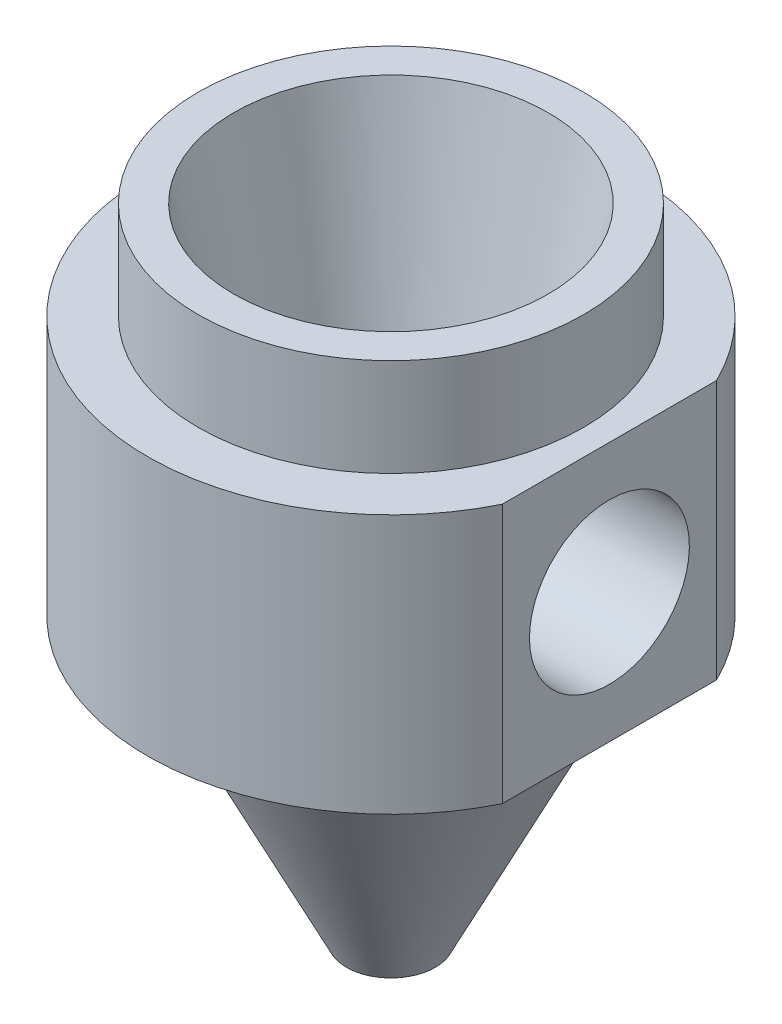
ISO-10303-21;
HEADER;
FILE_DESCRIPTION(('STEP AP214'),'2;1');
FILE_NAME('part.step','',(''),(''),'','','');
FILE_SCHEMA(('AUTOMOTIVE_DESIGN { 1 0 10303 214 1 1 1 1 }'));
ENDSEC;
DATA;
#1=APPLICATION_CONTEXT('core data for automotive mechanical design processes');
#2=APPLICATION_PROTOCOL_DEFINITION('international standard','automotive_design',2000,#1);
#3=PRODUCT_CONTEXT('',#1,'mechanical');
#4=PRODUCT('Part','Part','',(#3));
#5=PRODUCT_RELATED_PRODUCT_CATEGORY('part','',(#4));
#6=PRODUCT_DEFINITION_FORMATION('','',#4);
#7=PRODUCT_DEFINITION_CONTEXT('part definition',#1,'design');
#8=PRODUCT_DEFINITION('design','',#6,#7);
#9=PRODUCT_DEFINITION_SHAPE('','',#8);
#10=(LENGTH_UNIT() NAMED_UNIT(*) SI_UNIT(.MILLI.,.METRE.));
#11=(NAMED_UNIT(*) PLANE_ANGLE_UNIT() SI_UNIT($,.RADIAN.));
#12=(NAMED_UNIT(*) SI_UNIT($,.STERADIAN.) SOLID_ANGLE_UNIT());
#13=UNCERTAINTY_MEASURE_WITH_UNIT(LENGTH_MEASURE(1.E-05),#10,'distance_accuracy_value','');
#14=(GEOMETRIC_REPRESENTATION_CONTEXT(3) GLOBAL_UNCERTAINTY_ASSIGNED_CONTEXT((#13)) GLOBAL_UNIT_ASSIGNED_CONTEXT((#10,
#11,#12)) REPRESENTATION_CONTEXT('',''));
#15=CARTESIAN_POINT('',(0.,0.,0.));
#16=DIRECTION('',(0.,0.,1.));
#17=DIRECTION('',(1.,0.,0.));
#18=AXIS2_PLACEMENT_3D('',#15,#16,#17);
#19=CARTESIAN_POINT('',(12.3,23.2,0.));
#20=DIRECTION('',(1.,0.,0.));
#21=DIRECTION('',(0.,1.,0.));
#22=AXIS2_PLACEMENT_3D('',#19,#20,#21);
#23=CYLINDRICAL_SURFACE('',#22,4.5);
#24=CARTESIAN_POINT('',(12.3,23.2,0.));
#25=DIRECTION('',(-1.,0.,0.));
#26=DIRECTION('',(0.,0.,1.));
#27=AXIS2_PLACEMENT_3D('',#24,#25,#26);
#28=CIRCLE('',#27,4.5);
#29=CARTESIAN_POINT('',(12.3,23.2,4.5));
#30=VERTEX_POINT('',#29);
#31=EDGE_CURVE('E11',#30,#30,#28,.F.);
#32=ORIENTED_EDGE('',*,*,#31,.T.);
#33=EDGE_LOOP('',(#32));
#34=FACE_BOUND('',#33,.T.);
#35=CARTESIAN_POINT('',(4.43206173368688,23.6707733522292,-4.47530696721809));
#36=CARTESIAN_POINT('',(4.54231611237199,23.946237783731,-4.44633543448318));
#37=CARTESIAN_POINT('',(4.67128447010114,24.2120518004574,-4.39269465902064));
#38=CARTESIAN_POINT('',(4.87803637349295,24.5938879551387,-4.28075297218306));
#39=CARTESIAN_POINT('',(4.9494158484049,24.7187181446962,-4.23800779564339));
#40=CARTESIAN_POINT('',(5.09495258692768,24.9628163197711,-4.14241770555253));
#41=CARTESIAN_POINT('',(5.16910893983536,25.0820861005616,-4.08957608030202));
#42=CARTESIAN_POINT('',(5.31798471874702,25.3139228396817,-3.97466063168451));
#43=CARTESIAN_POINT('',(5.39269314618085,25.4265402802392,-3.9126737712626));
#44=CARTESIAN_POINT('',(5.54207254689429,25.6461031682401,-3.77929627570656));
#45=CARTESIAN_POINT('',(5.61674350187922,25.7530468806874,-3.70790278705984));
#46=CARTESIAN_POINT('',(5.83862990082187,26.0645313737801,-3.4800255153286));
#47=CARTESIAN_POINT('',(5.98414695653242,26.2603739186137,-3.30952379885632));
#48=CARTESIAN_POINT('',(6.24486702075352,26.6025824737896,-2.95395531452087));
#49=CARTESIAN_POINT('',(6.36161819585034,26.7520618610168,-2.773017398162));
#50=CARTESIAN_POINT('',(6.57775850552325,27.024667136942,-2.38293736638698));
#51=CARTESIAN_POINT('',(6.67716478051873,27.1478190701406,-2.17382346122529));
#52=CARTESIAN_POINT('',(6.83529381624055,27.3418843114614,-1.7706386088907));
#53=CARTESIAN_POINT('',(6.89813472160212,27.4182365253466,-1.58084792033195));
#54=CARTESIAN_POINT('',(6.97698647635464,27.5135775994754,-1.2859858951083));
#55=CARTESIAN_POINT('',(7.00070548420722,27.5421640641713,-1.18598051569663));
#56=CARTESIAN_POINT('',(7.04257865019685,27.5925301416699,-0.983147683519026));
#57=CARTESIAN_POINT('',(7.06073514001555,27.6143126066303,-0.880321432946208));
#58=CARTESIAN_POINT('',(7.09120239982267,27.6508174344308,-0.67192525442075));
#59=CARTESIAN_POINT('',(7.10347786245107,27.6654971603347,-0.566342671388003));
#60=CARTESIAN_POINT('',(7.12174771111945,27.6873317641869,-0.353904171784354));
#61=CARTESIAN_POINT('',(7.12774481063439,27.6944898929343,-0.247048825507187));
#62=CARTESIAN_POINT('',(7.13332801830771,27.7011542842864,-0.0329258833863638));
#63=CARTESIAN_POINT('',(7.13291377451197,27.7006601268148,0.0743417347660189));
#64=CARTESIAN_POINT('',(7.12568352294629,27.692029010968,0.288345556430286));
#65=CARTESIAN_POINT('',(7.11886788755581,27.6838924971612,0.395081790490577));
#66=CARTESIAN_POINT('',(7.09986802664774,27.6611796920887,0.597778697938381));
#67=CARTESIAN_POINT('',(7.08820966265686,27.6472338838009,0.693860267340494));
#68=CARTESIAN_POINT('',(7.05991989853131,27.6133332714744,0.884223917929356));
#69=CARTESIAN_POINT('',(7.04328693158736,27.5933765742219,0.978505422196847));
#70=CARTESIAN_POINT('',(6.98634443193493,27.5249002512632,1.25772792243046));
#71=CARTESIAN_POINT('',(6.9389751635835,27.4677552947548,1.43921187132039));
#72=CARTESIAN_POINT('',(6.8250676941014,27.3293117503256,1.79952191016723));
#73=CARTESIAN_POINT('',(6.75756317742218,27.2467867108302,1.97755901361231));
#74=CARTESIAN_POINT('',(6.60847900464403,27.0625277983461,2.31694259398778));
#75=CARTESIAN_POINT('',(6.52689049253343,26.9607818354257,2.47827846646032));
#76=CARTESIAN_POINT('',(6.3120769204417,26.6890373206176,2.8553892238066));
#77=CARTESIAN_POINT('',(6.17266721144555,26.5095031714897,3.0608731725944));
#78=CARTESIAN_POINT('',(5.95435938743603,26.2192140713863,3.33952700212613));
#79=CARTESIAN_POINT('',(5.87993147708666,26.1187755441865,3.42759997965992));
#80=CARTESIAN_POINT('',(5.7291673165442,25.9113499567029,3.59391601397033));
#81=CARTESIAN_POINT('',(5.65283128800225,25.8043636549507,3.67216020617606));
#82=CARTESIAN_POINT('',(5.49837713466498,25.582642580868,3.81982036956719));
#83=CARTESIAN_POINT('',(5.42024934637936,25.4678166531753,3.88908875772242));
#84=CARTESIAN_POINT('',(5.26467820623912,25.2320555192606,4.01730734298832));
#85=CARTESIAN_POINT('',(5.18723497976228,25.1111192200875,4.07625568569165));
#86=CARTESIAN_POINT('',(5.03470558725129,24.8634043472346,4.18345262012515));
#87=CARTESIAN_POINT('',(4.9596163273594,24.7366340333569,4.23171580920079));
#88=CARTESIAN_POINT('',(4.81358041360327,24.4771731970034,4.31711386963855));
#89=CARTESIAN_POINT('',(4.74263188758494,24.3444853986354,4.35425380204854));
#90=CARTESIAN_POINT('',(4.58403571707807,24.0270216042369,4.42728394140908));
#91=CARTESIAN_POINT('',(4.49888987809564,23.8398475814226,4.4584744818857));
#92=CARTESIAN_POINT('',(4.34701058421073,23.4559163692994,4.49683721214559));
#93=CARTESIAN_POINT('',(4.28023909032264,23.2591799856647,4.50405937014719));
#94=CARTESIAN_POINT('',(4.18086077700792,22.8895434205678,4.49248369217784));
#95=CARTESIAN_POINT('',(4.14461723936173,22.7175305448473,4.47745072944884));
#96=CARTESIAN_POINT('',(4.09445603863141,22.3733166887802,4.42682460057026));
#97=CARTESIAN_POINT('',(4.08051861793393,22.2011160102418,4.39124966749952));
#98=CARTESIAN_POINT('',(4.07512183277495,21.8620446016991,4.30007829095086));
#99=CARTESIAN_POINT('',(4.08363369506615,21.6951673262287,4.24450755495349));
#100=CARTESIAN_POINT('',(4.11959830791044,21.3707204986886,4.11513934933672));
#101=CARTESIAN_POINT('',(4.14708216168337,21.2131666929775,4.0413120771768));
#102=CARTESIAN_POINT('',(4.22950068341473,20.8490401322904,3.84464549283209));
#103=CARTESIAN_POINT('',(4.29102409212069,20.6481512453137,3.71402459798482));
#104=CARTESIAN_POINT('',(4.39278689868353,20.3662972675209,3.49774869453983));
#105=CARTESIAN_POINT('',(4.42834355196682,20.2754797685225,3.42214654477995));
#106=CARTESIAN_POINT('',(4.50119163195956,20.1004046147975,3.2644094477685));
#107=CARTESIAN_POINT('',(4.53848288416698,20.0161463024818,3.18227515706797));
#108=CARTESIAN_POINT('',(4.61446068372869,19.8522465052454,3.009503080097));
#109=CARTESIAN_POINT('',(4.65315792440116,19.7727879963741,2.91869696606622));
#110=CARTESIAN_POINT('',(4.7296989111681,19.6212573729183,2.73078086054825));
#111=CARTESIAN_POINT('',(4.76754270915215,19.5491848083166,2.63367125371524));
#112=CARTESIAN_POINT('',(4.84118923755926,19.4128363404491,2.43352428433556));
#113=CARTESIAN_POINT('',(4.87699376658424,19.3485535085092,2.33049231159738));
#114=CARTESIAN_POINT('',(4.9455197824984,19.228180521408,2.11883455553172));
#115=CARTESIAN_POINT('',(4.97824295997366,19.1720858643926,2.01021189073796));
#116=CARTESIAN_POINT('',(5.0365726255612,19.0737495005662,1.79895469198982));
#117=CARTESIAN_POINT('',(5.06256364647288,19.0306830022456,1.69681023121156));
#118=CARTESIAN_POINT('',(5.11061724088172,18.951977759841,1.48884514230869));
#119=CARTESIAN_POINT('',(5.13268159214309,18.9163356531783,1.38302620383762));
#120=CARTESIAN_POINT('',(5.17231668984802,18.852852896184,1.16826635270318));
#121=CARTESIAN_POINT('',(5.18988829543719,18.8250107541712,1.05932604137619));
#122=CARTESIAN_POINT('',(5.2200652706169,18.7774691273901,0.838999474884794));
#123=CARTESIAN_POINT('',(5.23267063686343,18.7577696481047,0.727613218073464));
#124=CARTESIAN_POINT('',(5.252596916357,18.7267279033582,0.502759196510914));
#125=CARTESIAN_POINT('',(5.25989686284311,18.7154187926005,0.389284970848542));
#126=CARTESIAN_POINT('',(5.26891662692737,18.7014555716815,0.161581449352932));
#127=CARTESIAN_POINT('',(5.27063642192299,18.6988014965776,0.0473521504631289));
#128=CARTESIAN_POINT('',(5.26844453223516,18.7021897381684,-0.180923266267714));
#129=CARTESIAN_POINT('',(5.26453280717981,18.7082321172073,-0.294969382789666));
#130=CARTESIAN_POINT('',(5.25119440705338,18.7289196070367,-0.521946026362317));
#131=CARTESIAN_POINT('',(5.24176791382853,18.7435644341667,-0.63487659007286));
#132=CARTESIAN_POINT('',(5.21845147536894,18.780025269898,-0.851526488801305));
#133=CARTESIAN_POINT('',(5.20488895161142,18.8013173130196,-0.955369833863048));
#134=CARTESIAN_POINT('',(5.17351652970713,18.8509847685644,-1.16070699326619));
#135=CARTESIAN_POINT('',(5.155705173126,18.879362613383,-1.26219998768472));
#136=CARTESIAN_POINT('',(5.09651993329491,18.9746634551251,-1.56220172096393));
#137=CARTESIAN_POINT('',(5.04937174562314,19.0517886860304,-1.75643668980507));
#138=CARTESIAN_POINT('',(4.93964292624672,19.2376799782131,-2.14479067931778));
#139=CARTESIAN_POINT('',(4.87612733362484,19.3484888788668,-2.33764893456904));
#140=CARTESIAN_POINT('',(4.74207133746291,19.5960275902216,-2.70375617467126));
#141=CARTESIAN_POINT('',(4.67151886689472,19.7328023035256,-2.87697034770814));
#142=CARTESIAN_POINT('',(4.5602771946299,19.9679028286789,-3.13367933627497));
#143=CARTESIAN_POINT('',(4.51943323382368,20.0584001694858,-3.22441051011655));
#144=CARTESIAN_POINT('',(4.43954815449252,20.2472909521844,-3.39823241362362));
#145=CARTESIAN_POINT('',(4.40050752825598,20.3456865303629,-3.48132106303786));
#146=CARTESIAN_POINT('',(4.32623204471894,20.5499521125011,-3.63921305566368));
#147=CARTESIAN_POINT('',(4.29098985888887,20.6558070472672,-3.71403236072251));
#148=CARTESIAN_POINT('',(4.22640354785131,20.8748547137165,-3.85495337791061));
#149=CARTESIAN_POINT('',(4.19705842049968,20.9880461942981,-3.92105657059547));
#150=CARTESIAN_POINT('',(4.13769763967285,21.2627565362214,-4.06557696365991));
#151=CARTESIAN_POINT('',(4.11113475502886,21.4271784322952,-4.14004770856152));
#152=CARTESIAN_POINT('',(4.0790417821953,21.7654651186624,-4.26904647216594));
#153=CARTESIAN_POINT('',(4.07347396946901,21.9393124022316,-4.32361010097786));
#154=CARTESIAN_POINT('',(4.08665579657145,22.2922586912787,-4.41125776025896));
#155=CARTESIAN_POINT('',(4.10550634452638,22.4713764808695,-4.44425180536855));
#156=CARTESIAN_POINT('',(4.16670565433552,22.8282754884532,-4.48823017073519));
#157=CARTESIAN_POINT('',(4.20906335025575,23.0060561722161,-4.49920611552643));
#158=CARTESIAN_POINT('',(4.28551290144704,23.263995207261,-4.50031750383071));
#159=CARTESIAN_POINT('',(4.31230085500157,23.3464815768327,-4.49836087816681));
#160=CARTESIAN_POINT('',(4.3695554506833,23.5098404022028,-4.49006336000337));
#161=CARTESIAN_POINT('',(4.40001823327277,23.5907144490802,-4.48372703481322));
#162=CARTESIAN_POINT('',(4.43206173368688,23.6707733522292,-4.47530696721809));
#163=B_SPLINE_CURVE_WITH_KNOTS('',3,(#35,#36,#37,#38,#39,#40,#41,#42,#43,#44,#45,#46,#47,#48,
#49,#50,#51,#52,#53,#54,#55,#56,#57,#58,#59,#60,#61,#62,#63,#64,#65,#66,#67,#68,#69,#70,#71,#72,
#73,#74,#75,#76,#77,#78,#79,#80,#81,#82,#83,#84,#85,#86,#87,#88,#89,#90,#91,#92,#93,#94,#95,#96,
#97,#98,#99,#100,#101,#102,#103,#104,#105,#106,#107,#108,#109,#110,#111,#112,#113,#114,#115,
#116,#117,#118,#119,#120,#121,#122,#123,#124,#125,#126,#127,#128,#129,#130,#131,#132,#133,#134,
#135,#136,#137,#138,#139,#140,#141,#142,#143,#144,#145,#146,#147,#148,#149,#150,#151,#152,#153,
#154,#155,#156,#157,#158,#159,#160,#161,#162),.UNSPECIFIED.,.T.,.F.,(4,2,2,2,2,2,2,2,2,2,2,2,2,
2,2,2,2,2,2,2,2,2,2,2,2,2,2,2,2,2,2,2,2,2,2,2,2,2,2,2,2,2,2,2,2,2,2,2,2,2,2,2,2,2,2,2,2,2,2,2,2,
2,2,4),(0.,0.89393911851822,1.34374635341282,1.79340734005592,2.23903935366866,2.68480686290166,
3.57384350655913,4.35738924333735,5.14015623145939,5.77929428553007,6.09899742398193,
6.41856636617516,6.74003055098359,7.06135574326183,7.38269857492036,7.70402271469589,
7.99703876353186,8.29014719855777,8.87586938267883,9.49615956873826,10.1168412233649,
11.0307577720343,11.4891846676399,11.9475585566087,12.4127076068239,12.8779401540008,
13.3425331548963,13.8069144451233,14.4288588824956,15.0495059005215,15.5764215092829,
16.1028701444329,16.6286443583458,17.155282594925,17.8931412807206,18.2631015560118,
18.6330246931621,19.0128101583495,19.3925724698678,19.7719944783669,20.1512070887275,
20.4924344218568,20.8335068721862,21.1745140505303,21.5155214584905,21.8578692898314,
22.2002185078588,22.5425701801718,22.8849105642759,23.2051511736338,23.5255018658523,
24.1655869898883,24.8570507109709,25.5497212537193,25.952834639345,26.3560574274078,
26.7584877791073,27.1608496839851,27.7059020458079,28.2499745742242,28.7963026545209,
29.3428385131944,29.6029170420193,29.8627247599171),.UNSPECIFIED.);
#164=CARTESIAN_POINT('',(4.43206173368688,23.6707733522292,-4.47530696721809));
#165=VERTEX_POINT('',#164);
#166=EDGE_CURVE('E27',#165,#165,#163,.F.);
#167=ORIENTED_EDGE('',*,*,#166,.T.);
#168=EDGE_LOOP('',(#167));
#169=FACE_BOUND('',#168,.T.);
#170=ADVANCED_FACE('F16',(#34,#169),#23,.F.);
#171=CARTESIAN_POINT('',(0.,0.,0.));
#172=DIRECTION('',(0.,-1.,0.));
#173=DIRECTION('',(0.,0.,-1.));
#174=AXIS2_PLACEMENT_3D('',#171,#172,#173);
#175=CYLINDRICAL_SURFACE('',#174,10.85);
#176=CARTESIAN_POINT('',(0.,36.,0.));
#177=DIRECTION('',(0.,1.,0.));
#178=DIRECTION('',(0.,0.,1.));
#179=AXIS2_PLACEMENT_3D('',#176,#177,#178);
#180=CIRCLE('',#179,10.85);
#181=CARTESIAN_POINT('',(0.,36.,10.85));
#182=VERTEX_POINT('',#181);
#183=EDGE_CURVE('E57',#182,#182,#180,.F.);
#184=ORIENTED_EDGE('',*,*,#183,.T.);
#185=EDGE_LOOP('',(#184));
#186=FACE_BOUND('',#185,.T.);
#187=CARTESIAN_POINT('',(0.,30.5,0.));
#188=DIRECTION('',(0.,1.,0.));
#189=DIRECTION('',(0.,0.,1.));
#190=AXIS2_PLACEMENT_3D('',#187,#188,#189);
#191=CIRCLE('',#190,10.85);
#192=CARTESIAN_POINT('',(0.,30.5,10.85));
#193=VERTEX_POINT('',#192);
#194=EDGE_CURVE('E67',#193,#193,#191,.F.);
#195=ORIENTED_EDGE('',*,*,#194,.F.);
#196=EDGE_LOOP('',(#195));
#197=FACE_BOUND('',#196,.T.);
#198=ADVANCED_FACE('F90',(#186,#197),#175,.T.);
#199=CARTESIAN_POINT('',(0.,0.,0.));
#200=DIRECTION('',(0.,-1.,0.));
#201=DIRECTION('',(0.,0.,-1.));
#202=AXIS2_PLACEMENT_3D('',#199,#200,#201);
#203=CYLINDRICAL_SURFACE('',#202,13.7);
#204=CARTESIAN_POINT('',(0.,30.5,0.));
#205=DIRECTION('',(0.,1.,0.));
#206=DIRECTION('',(0.,0.,1.));
#207=AXIS2_PLACEMENT_3D('',#204,#205,#206);
#208=CIRCLE('',#207,13.7);
#209=CARTESIAN_POINT('',(12.3,30.5,6.03324125159934));
#210=VERTEX_POINT('',#209);
#211=CARTESIAN_POINT('',(12.3,30.5,-6.03324125159934));
#212=VERTEX_POINT('',#211);
#213=EDGE_CURVE('E49',#210,#212,#208,.F.);
#214=ORIENTED_EDGE('',*,*,#213,.T.);
#215=DIRECTION('',(0.,-1.,0.));
#216=VECTOR('',#215,1.);
#217=CARTESIAN_POINT('',(12.3,0.,-6.03324125159934));
#218=LINE('',#217,#216);
#219=CARTESIAN_POINT('',(12.3,15.9,-6.03324125159934));
#220=VERTEX_POINT('',#219);
#221=EDGE_CURVE('E36',#220,#212,#218,.F.);
#222=ORIENTED_EDGE('',*,*,#221,.F.);
#223=CARTESIAN_POINT('',(0.,15.9,0.));
#224=DIRECTION('',(0.,-1.,0.));
#225=DIRECTION('',(0.,0.,-1.));
#226=AXIS2_PLACEMENT_3D('',#223,#224,#225);
#227=CIRCLE('',#226,13.7);
#228=CARTESIAN_POINT('',(12.3,15.9,6.03324125159934));
#229=VERTEX_POINT('',#228);
#230=EDGE_CURVE('E44',#229,#220,#227,.T.);
#231=ORIENTED_EDGE('',*,*,#230,.F.);
#232=DIRECTION('',(0.,-1.,0.));
#233=VECTOR('',#232,1.);
#234=CARTESIAN_POINT('',(12.3,0.,6.03324125159934));
#235=LINE('',#234,#233);
#236=EDGE_CURVE('E46',#229,#210,#235,.F.);
#237=ORIENTED_EDGE('',*,*,#236,.T.);
#238=EDGE_LOOP('',(#214,#222,#231,#237));
#239=FACE_BOUND('',#238,.T.);
#240=ADVANCED_FACE('F48',(#239),#203,.T.);
#241=CARTESIAN_POINT('',(0.,0.,0.));
#242=DIRECTION('',(0.,1.,0.));
#243=DIRECTION('',(1.,0.,0.));
#244=AXIS2_PLACEMENT_3D('',#241,#242,#243);
#245=CONICAL_SURFACE('',#244,2.5,0.458603515588316);
#246=CARTESIAN_POINT('',(0.,0.,0.));
#247=DIRECTION('',(0.,-1.,0.));
#248=DIRECTION('',(0.,0.,-1.));
#249=AXIS2_PLACEMENT_3D('',#246,#247,#248);
#250=CIRCLE('',#249,2.5);
#251=CARTESIAN_POINT('',(2.5,0.,0.));
#252=VERTEX_POINT('',#251);
#253=EDGE_CURVE('E71',#252,#252,#250,.T.);
#254=CARTESIAN_POINT('',(0.,15.9,0.));
#255=DIRECTION('',(0.,-1.,0.));
#256=DIRECTION('',(0.,0.,-1.));
#257=AXIS2_PLACEMENT_3D('',#254,#255,#256);
#258=CIRCLE('',#257,10.35);
#259=CARTESIAN_POINT('',(10.35,15.9,0.));
#260=VERTEX_POINT('',#259);
#261=EDGE_CURVE('E52',#260,#260,#258,.T.);
#262=CARTESIAN_POINT('',(2.5,0.,0.));
#263=CARTESIAN_POINT('',(2.58177083333333,0.165625,0.));
#264=CARTESIAN_POINT('',(2.66354166666667,0.33125,0.));
#265=CARTESIAN_POINT('',(2.82708333333333,0.6625,0.));
#266=CARTESIAN_POINT('',(2.90885416666667,0.828125,0.));
#267=CARTESIAN_POINT('',(3.07239583333333,1.159375,0.));
#268=CARTESIAN_POINT('',(3.15416666666667,1.325,0.));
#269=CARTESIAN_POINT('',(3.31770833333333,1.65625,0.));
#270=CARTESIAN_POINT('',(3.39947916666667,1.821875,0.));
#271=CARTESIAN_POINT('',(3.56302083333333,2.153125,0.));
#272=CARTESIAN_POINT('',(3.64479166666667,2.31875,0.));
#273=CARTESIAN_POINT('',(3.80833333333333,2.65,0.));
#274=CARTESIAN_POINT('',(3.89010416666667,2.815625,0.));
#275=CARTESIAN_POINT('',(4.05364583333334,3.146875,0.));
#276=CARTESIAN_POINT('',(4.13541666666667,3.3125,0.));
#277=CARTESIAN_POINT('',(4.29895833333333,3.64375,0.));
#278=CARTESIAN_POINT('',(4.38072916666667,3.809375,0.));
#279=CARTESIAN_POINT('',(4.54427083333333,4.140625,0.));
#280=CARTESIAN_POINT('',(4.62604166666667,4.30625,0.));
#281=CARTESIAN_POINT('',(4.78958333333333,4.6375,0.));
#282=CARTESIAN_POINT('',(4.87135416666667,4.803125,0.));
#283=CARTESIAN_POINT('',(5.03489583333333,5.134375,0.));
#284=CARTESIAN_POINT('',(5.11666666666667,5.3,0.));
#285=CARTESIAN_POINT('',(5.28020833333334,5.63125,0.));
#286=CARTESIAN_POINT('',(5.36197916666667,5.796875,0.));
#287=CARTESIAN_POINT('',(5.52552083333333,6.128125,0.));
#288=CARTESIAN_POINT('',(5.60729166666667,6.29375,0.));
#289=CARTESIAN_POINT('',(5.77083333333333,6.625,0.));
#290=CARTESIAN_POINT('',(5.85260416666667,6.790625,0.));
#291=CARTESIAN_POINT('',(6.01614583333334,7.121875,0.));
#292=CARTESIAN_POINT('',(6.09791666666667,7.2875,0.));
#293=CARTESIAN_POINT('',(6.26145833333334,7.61875,0.));
#294=CARTESIAN_POINT('',(6.34322916666667,7.784375,0.));
#295=CARTESIAN_POINT('',(6.50677083333334,8.115625,0.));
#296=CARTESIAN_POINT('',(6.58854166666667,8.28125,0.));
#297=CARTESIAN_POINT('',(6.75208333333334,8.6125,0.));
#298=CARTESIAN_POINT('',(6.83385416666667,8.778125,0.));
#299=CARTESIAN_POINT('',(6.99739583333334,9.109375,0.));
#300=CARTESIAN_POINT('',(7.07916666666667,9.275,0.));
#301=CARTESIAN_POINT('',(7.24270833333334,9.60625,0.));
#302=CARTESIAN_POINT('',(7.32447916666667,9.771875,0.));
#303=CARTESIAN_POINT('',(7.48802083333334,10.103125,0.));
#304=CARTESIAN_POINT('',(7.56979166666667,10.26875,0.));
#305=CARTESIAN_POINT('',(7.73333333333334,10.6,0.));
#306=CARTESIAN_POINT('',(7.81510416666667,10.765625,0.));
#307=CARTESIAN_POINT('',(7.97864583333334,11.096875,0.));
#308=CARTESIAN_POINT('',(8.06041666666667,11.2625,0.));
#309=CARTESIAN_POINT('',(8.22395833333334,11.59375,0.));
#310=CARTESIAN_POINT('',(8.30572916666667,11.759375,0.));
#311=CARTESIAN_POINT('',(8.46927083333334,12.090625,0.));
#312=CARTESIAN_POINT('',(8.55104166666667,12.25625,0.));
#313=CARTESIAN_POINT('',(8.71458333333334,12.5875,0.));
#314=CARTESIAN_POINT('',(8.79635416666667,12.753125,0.));
#315=CARTESIAN_POINT('',(8.95989583333334,13.084375,0.));
#316=CARTESIAN_POINT('',(9.04166666666667,13.25,0.));
#317=CARTESIAN_POINT('',(9.20520833333334,13.58125,0.));
#318=CARTESIAN_POINT('',(9.28697916666667,13.746875,0.));
#319=CARTESIAN_POINT('',(9.45052083333334,14.078125,0.));
#320=CARTESIAN_POINT('',(9.53229166666667,14.24375,0.));
#321=CARTESIAN_POINT('',(9.69583333333334,14.575,0.));
#322=CARTESIAN_POINT('',(9.77760416666667,14.740625,0.));
#323=CARTESIAN_POINT('',(9.94114583333334,15.071875,0.));
#324=CARTESIAN_POINT('',(10.0229166666667,15.2375,0.));
#325=CARTESIAN_POINT('',(10.1864583333333,15.56875,0.));
#326=CARTESIAN_POINT('',(10.2682291666667,15.734375,0.));
#327=CARTESIAN_POINT('',(10.35,15.9,0.));
#328=B_SPLINE_CURVE_WITH_KNOTS('',3,(#262,#263,#264,#265,#266,#267,#268,#269,#270,#271,#272,
#273,#274,#275,#276,#277,#278,#279,#280,#281,#282,#283,#284,#285,#286,#287,#288,#289,#290,#291,
#292,#293,#294,#295,#296,#297,#298,#299,#300,#301,#302,#303,#304,#305,#306,#307,#308,#309,#310,
#311,#312,#313,#314,#315,#316,#317,#318,#319,#320,#321,#322,#323,#324,#325,#326,#327),
.UNSPECIFIED.,.F.,.F.,(4,2,2,2,2,2,2,2,2,2,2,2,2,2,2,2,2,2,2,2,2,2,2,2,2,2,2,2,2,2,2,2,4),(0.,
0.55413264502396,1.10826529004792,1.66239793507188,2.21653058009584,2.7706632251198,
3.32479587014376,3.87892851516772,4.43306116019168,4.98719380521564,5.5413264502396,
6.09545909526356,6.64959174028752,7.20372438531148,7.75785703033544,8.3119896753594,
8.86612232038336,9.42025496540732,9.97438761043128,10.5285202554552,11.0826529004792,
11.6367855455032,12.1909181905271,12.7450508355511,13.299183480575,13.853316125599,
14.407448770623,14.9615814156469,15.5157140606709,16.0698467056948,16.6239793507188,
17.1781119957428,17.7322446407667),.UNSPECIFIED.);
#329=EDGE_CURVE('BSEAM97',#252,#260,#328,.T.);
#330=ORIENTED_EDGE('',*,*,#253,.F.);
#331=ORIENTED_EDGE('',*,*,#261,.T.);
#332=ORIENTED_EDGE('',*,*,#329,.T.);
#333=ORIENTED_EDGE('',*,*,#329,.F.);
#334=EDGE_LOOP('',(#330,#332,#331,#333));
#335=FACE_BOUND('',#334,.T.);
#336=ADVANCED_FACE('F97',(#335),#245,.T.);
#337=CARTESIAN_POINT('',(0.,36.,0.));
#338=DIRECTION('',(0.,1.,0.));
#339=DIRECTION('',(1.,0.,0.));
#340=AXIS2_PLACEMENT_3D('',#337,#338,#339);
#341=CONICAL_SURFACE('',#340,8.85,0.204063905926676);
#342=CARTESIAN_POINT('',(0.,36.,0.));
#343=DIRECTION('',(0.,1.,0.));
#344=DIRECTION('',(0.,0.,1.));
#345=AXIS2_PLACEMENT_3D('',#342,#343,#344);
#346=CIRCLE('',#345,8.85);
#347=CARTESIAN_POINT('',(0.,36.,8.85));
#348=VERTEX_POINT('',#347);
#349=EDGE_CURVE('E62',#348,#348,#346,.F.);
#350=ORIENTED_EDGE('',*,*,#349,.F.);
#351=EDGE_LOOP('',(#350));
#352=FACE_BOUND('',#351,.T.);
#353=CARTESIAN_POINT('',(0.,0.,0.));
#354=DIRECTION('',(0.,-1.,0.));
#355=DIRECTION('',(0.,0.,-1.));
#356=AXIS2_PLACEMENT_3D('',#353,#354,#355);
#357=CIRCLE('',#356,1.40000000000003);
#358=CARTESIAN_POINT('',(0.,0.,-1.40000000000003));
#359=VERTEX_POINT('',#358);
#360=EDGE_CURVE('E74',#359,#359,#357,.T.);
#361=ORIENTED_EDGE('',*,*,#360,.T.);
#362=EDGE_LOOP('',(#361));
#363=FACE_BOUND('',#362,.T.);
#364=ORIENTED_EDGE('',*,*,#166,.F.);
#365=EDGE_LOOP('',(#364));
#366=FACE_BOUND('',#365,.T.);
#367=ADVANCED_FACE('F18',(#352,#363,#366),#341,.F.);
#368=CARTESIAN_POINT('',(1.4,0.,0.));
#369=DIRECTION('',(0.,-1.,0.));
#370=DIRECTION('',(0.,0.,-1.));
#371=AXIS2_PLACEMENT_3D('',#368,#369,#370);
#372=PLANE('',#371);
#373=ORIENTED_EDGE('',*,*,#253,.T.);
#374=EDGE_LOOP('',(#373));
#375=FACE_BOUND('',#374,.T.);
#376=ORIENTED_EDGE('',*,*,#360,.F.);
#377=EDGE_LOOP('',(#376));
#378=FACE_BOUND('',#377,.T.);
#379=ADVANCED_FACE('F104',(#375,#378),#372,.T.);
#380=CARTESIAN_POINT('',(10.35,15.9,0.));
#381=DIRECTION('',(0.,-1.,0.));
#382=DIRECTION('',(0.,0.,-1.));
#383=AXIS2_PLACEMENT_3D('',#380,#381,#382);
#384=PLANE('',#383);
#385=DIRECTION('',(0.,0.,1.));
#386=VECTOR('',#385,1.);
#387=CARTESIAN_POINT('',(12.3,15.9,0.));
#388=LINE('',#387,#386);
#389=EDGE_CURVE('E61',#229,#220,#388,.F.);
#390=ORIENTED_EDGE('',*,*,#389,.F.);
#391=ORIENTED_EDGE('',*,*,#230,.T.);
#392=EDGE_LOOP('',(#390,#391));
#393=FACE_BOUND('',#392,.T.);
#394=ORIENTED_EDGE('',*,*,#261,.F.);
#395=EDGE_LOOP('',(#394));
#396=FACE_BOUND('',#395,.T.);
#397=ADVANCED_FACE('F110',(#393,#396),#384,.T.);
#398=CARTESIAN_POINT('',(13.7,30.5,0.));
#399=DIRECTION('',(0.,1.,0.));
#400=DIRECTION('',(0.,0.,1.));
#401=AXIS2_PLACEMENT_3D('',#398,#399,#400);
#402=PLANE('',#401);
#403=DIRECTION('',(0.,0.,-1.));
#404=VECTOR('',#403,1.);
#405=CARTESIAN_POINT('',(12.3,30.5,0.));
#406=LINE('',#405,#404);
#407=EDGE_CURVE('E21',#212,#210,#406,.F.);
#408=ORIENTED_EDGE('',*,*,#407,.F.);
#409=ORIENTED_EDGE('',*,*,#213,.F.);
#410=EDGE_LOOP('',(#408,#409));
#411=FACE_BOUND('',#410,.T.);
#412=ORIENTED_EDGE('',*,*,#194,.T.);
#413=EDGE_LOOP('',(#412));
#414=FACE_BOUND('',#413,.T.);
#415=ADVANCED_FACE('F55',(#411,#414),#402,.T.);
#416=CARTESIAN_POINT('',(10.85,36.,0.));
#417=DIRECTION('',(0.,1.,0.));
#418=DIRECTION('',(0.,0.,1.));
#419=AXIS2_PLACEMENT_3D('',#416,#417,#418);
#420=PLANE('',#419);
#421=ORIENTED_EDGE('',*,*,#183,.F.);
#422=EDGE_LOOP('',(#421));
#423=FACE_BOUND('',#422,.T.);
#424=ORIENTED_EDGE('',*,*,#349,.T.);
#425=EDGE_LOOP('',(#424));
#426=FACE_BOUND('',#425,.T.);
#427=ADVANCED_FACE('F118',(#423,#426),#420,.T.);
#428=CARTESIAN_POINT('',(12.3,0.,0.));
#429=DIRECTION('',(-1.,0.,0.));
#430=DIRECTION('',(0.,0.,1.));
#431=AXIS2_PLACEMENT_3D('',#428,#429,#430);
#432=PLANE('',#431);
#433=ORIENTED_EDGE('',*,*,#389,.T.);
#434=ORIENTED_EDGE('',*,*,#221,.T.);
#435=ORIENTED_EDGE('',*,*,#407,.T.);
#436=ORIENTED_EDGE('',*,*,#236,.F.);
#437=EDGE_LOOP('',(#433,#434,#435,#436));
#438=FACE_BOUND('',#437,.T.);
#439=ORIENTED_EDGE('',*,*,#31,.F.);
#440=EDGE_LOOP('',(#439));
#441=FACE_BOUND('',#440,.T.);
#442=ADVANCED_FACE('F59',(#438,#441),#432,.F.);
#443=CLOSED_SHELL('',(#170,#198,#240,#336,#367,#379,#397,#415,#427,#442));
#444=MANIFOLD_SOLID_BREP('B1',#443);
#445=ADVANCED_BREP_SHAPE_REPRESENTATION('',(#18,#444),#14);
#446=SHAPE_DEFINITION_REPRESENTATION(#9,#445);
ENDSEC;
END-ISO-10303-21;
